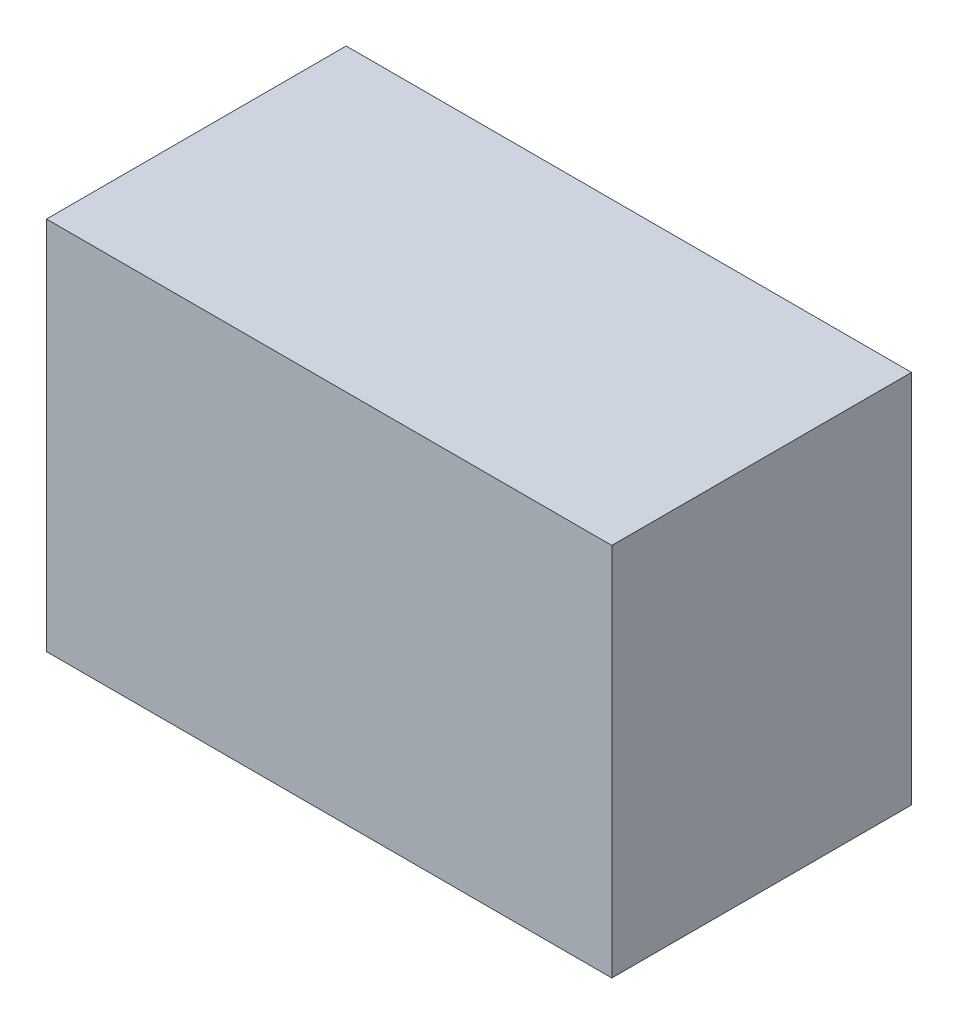
ISO-10303-21;
HEADER;
FILE_DESCRIPTION(('STEP AP214'),'2;1');
FILE_NAME('part.step','',(''),(''),'','','');
FILE_SCHEMA(('AUTOMOTIVE_DESIGN { 1 0 10303 214 1 1 1 1 }'));
ENDSEC;
DATA;
#1=APPLICATION_CONTEXT('core data for automotive mechanical design processes');
#2=APPLICATION_PROTOCOL_DEFINITION('international standard','automotive_design',2000,#1);
#3=PRODUCT_CONTEXT('',#1,'mechanical');
#4=PRODUCT('Part','Part','',(#3));
#5=PRODUCT_RELATED_PRODUCT_CATEGORY('part','',(#4));
#6=PRODUCT_DEFINITION_FORMATION('','',#4);
#7=PRODUCT_DEFINITION_CONTEXT('part definition',#1,'design');
#8=PRODUCT_DEFINITION('design','',#6,#7);
#9=PRODUCT_DEFINITION_SHAPE('','',#8);
#10=(LENGTH_UNIT() NAMED_UNIT(*) SI_UNIT(.MILLI.,.METRE.));
#11=(NAMED_UNIT(*) PLANE_ANGLE_UNIT() SI_UNIT($,.RADIAN.));
#12=(NAMED_UNIT(*) SI_UNIT($,.STERADIAN.) SOLID_ANGLE_UNIT());
#13=UNCERTAINTY_MEASURE_WITH_UNIT(LENGTH_MEASURE(1.E-05),#10,'distance_accuracy_value','');
#14=(GEOMETRIC_REPRESENTATION_CONTEXT(3) GLOBAL_UNCERTAINTY_ASSIGNED_CONTEXT((#13)) GLOBAL_UNIT_ASSIGNED_CONTEXT((#10,
#11,#12)) REPRESENTATION_CONTEXT('',''));
#15=CARTESIAN_POINT('',(0.,0.,0.));
#16=DIRECTION('',(0.,0.,1.));
#17=DIRECTION('',(1.,0.,0.));
#18=AXIS2_PLACEMENT_3D('',#15,#16,#17);
#19=CARTESIAN_POINT('',(166.,220.,-88.));
#20=DIRECTION('',(-1.,0.,0.));
#21=DIRECTION('',(0.,0.,1.));
#22=AXIS2_PLACEMENT_3D('',#19,#20,#21);
#23=PLANE('',#22);
#24=DIRECTION('',(0.,0.,-1.));
#25=VECTOR('',#24,1.);
#26=CARTESIAN_POINT('',(166.,0.,-88.));
#27=LINE('',#26,#25);
#28=CARTESIAN_POINT('',(166.,0.,88.));
#29=VERTEX_POINT('',#28);
#30=CARTESIAN_POINT('',(166.,0.,-88.));
#31=VERTEX_POINT('',#30);
#32=EDGE_CURVE('E102',#29,#31,#27,.T.);
#33=ORIENTED_EDGE('',*,*,#32,.T.);
#34=DIRECTION('',(0.,-1.,0.));
#35=VECTOR('',#34,1.);
#36=CARTESIAN_POINT('',(166.,220.,-88.));
#37=LINE('',#36,#35);
#38=CARTESIAN_POINT('',(166.,220.,-88.));
#39=VERTEX_POINT('',#38);
#40=EDGE_CURVE('E11',#39,#31,#37,.T.);
#41=ORIENTED_EDGE('',*,*,#40,.F.);
#42=DIRECTION('',(0.,0.,-1.));
#43=VECTOR('',#42,1.);
#44=CARTESIAN_POINT('',(166.,220.,-88.));
#45=LINE('',#44,#43);
#46=CARTESIAN_POINT('',(166.,220.,88.));
#47=VERTEX_POINT('',#46);
#48=EDGE_CURVE('E90',#47,#39,#45,.T.);
#49=ORIENTED_EDGE('',*,*,#48,.F.);
#50=DIRECTION('',(0.,-1.,0.));
#51=VECTOR('',#50,1.);
#52=CARTESIAN_POINT('',(166.,220.,88.));
#53=LINE('',#52,#51);
#54=EDGE_CURVE('E98',#47,#29,#53,.T.);
#55=ORIENTED_EDGE('',*,*,#54,.T.);
#56=EDGE_LOOP('',(#33,#41,#49,#55));
#57=FACE_BOUND('',#56,.T.);
#58=ADVANCED_FACE('F39',(#57),#23,.F.);
#59=CARTESIAN_POINT('',(-166.,220.,-88.));
#60=DIRECTION('',(0.,0.,1.));
#61=DIRECTION('',(1.,0.,0.));
#62=AXIS2_PLACEMENT_3D('',#59,#60,#61);
#63=PLANE('',#62);
#64=DIRECTION('',(-1.,0.,0.));
#65=VECTOR('',#64,1.);
#66=CARTESIAN_POINT('',(-166.,0.,-88.));
#67=LINE('',#66,#65);
#68=CARTESIAN_POINT('',(-166.,0.,-88.));
#69=VERTEX_POINT('',#68);
#70=EDGE_CURVE('E94',#31,#69,#67,.T.);
#71=ORIENTED_EDGE('',*,*,#70,.T.);
#72=DIRECTION('',(0.,-1.,0.));
#73=VECTOR('',#72,1.);
#74=CARTESIAN_POINT('',(-166.,220.,-88.));
#75=LINE('',#74,#73);
#76=CARTESIAN_POINT('',(-166.,220.,-88.));
#77=VERTEX_POINT('',#76);
#78=EDGE_CURVE('E47',#77,#69,#75,.T.);
#79=ORIENTED_EDGE('',*,*,#78,.F.);
#80=DIRECTION('',(-1.,0.,0.));
#81=VECTOR('',#80,1.);
#82=CARTESIAN_POINT('',(-166.,220.,-88.));
#83=LINE('',#82,#81);
#84=EDGE_CURVE('E85',#39,#77,#83,.T.);
#85=ORIENTED_EDGE('',*,*,#84,.F.);
#86=ORIENTED_EDGE('',*,*,#40,.T.);
#87=EDGE_LOOP('',(#71,#79,#85,#86));
#88=FACE_BOUND('',#87,.T.);
#89=ADVANCED_FACE('F93',(#88),#63,.F.);
#90=CARTESIAN_POINT('',(-166.,220.,-88.));
#91=DIRECTION('',(1.,0.,0.));
#92=DIRECTION('',(0.,0.,-1.));
#93=AXIS2_PLACEMENT_3D('',#90,#91,#92);
#94=PLANE('',#93);
#95=DIRECTION('',(0.,0.,1.));
#96=VECTOR('',#95,1.);
#97=CARTESIAN_POINT('',(-166.,0.,-88.));
#98=LINE('',#97,#96);
#99=CARTESIAN_POINT('',(-166.,0.,88.));
#100=VERTEX_POINT('',#99);
#101=EDGE_CURVE('E72',#69,#100,#98,.T.);
#102=ORIENTED_EDGE('',*,*,#101,.T.);
#103=DIRECTION('',(0.,-1.,0.));
#104=VECTOR('',#103,1.);
#105=CARTESIAN_POINT('',(-166.,220.,88.));
#106=LINE('',#105,#104);
#107=CARTESIAN_POINT('',(-166.,220.,88.));
#108=VERTEX_POINT('',#107);
#109=EDGE_CURVE('E95',#108,#100,#106,.T.);
#110=ORIENTED_EDGE('',*,*,#109,.F.);
#111=DIRECTION('',(0.,0.,1.));
#112=VECTOR('',#111,1.);
#113=CARTESIAN_POINT('',(-166.,220.,-88.));
#114=LINE('',#113,#112);
#115=EDGE_CURVE('E88',#77,#108,#114,.T.);
#116=ORIENTED_EDGE('',*,*,#115,.F.);
#117=ORIENTED_EDGE('',*,*,#78,.T.);
#118=EDGE_LOOP('',(#102,#110,#116,#117));
#119=FACE_BOUND('',#118,.T.);
#120=ADVANCED_FACE('F96',(#119),#94,.F.);
#121=CARTESIAN_POINT('',(-166.,220.,88.));
#122=DIRECTION('',(0.,0.,-1.));
#123=DIRECTION('',(-1.,0.,0.));
#124=AXIS2_PLACEMENT_3D('',#121,#122,#123);
#125=PLANE('',#124);
#126=DIRECTION('',(1.,0.,0.));
#127=VECTOR('',#126,1.);
#128=CARTESIAN_POINT('',(-166.,0.,88.));
#129=LINE('',#128,#127);
#130=EDGE_CURVE('E78',#100,#29,#129,.T.);
#131=ORIENTED_EDGE('',*,*,#130,.T.);
#132=ORIENTED_EDGE('',*,*,#54,.F.);
#133=DIRECTION('',(1.,0.,0.));
#134=VECTOR('',#133,1.);
#135=CARTESIAN_POINT('',(-166.,220.,88.));
#136=LINE('',#135,#134);
#137=EDGE_CURVE('E55',#108,#47,#136,.T.);
#138=ORIENTED_EDGE('',*,*,#137,.F.);
#139=ORIENTED_EDGE('',*,*,#109,.T.);
#140=EDGE_LOOP('',(#131,#132,#138,#139));
#141=FACE_BOUND('',#140,.T.);
#142=ADVANCED_FACE('F109',(#141),#125,.F.);
#143=CARTESIAN_POINT('',(0.,220.,0.));
#144=DIRECTION('',(0.,1.,0.));
#145=DIRECTION('',(0.,0.,1.));
#146=AXIS2_PLACEMENT_3D('',#143,#144,#145);
#147=PLANE('',#146);
#148=ORIENTED_EDGE('',*,*,#48,.T.);
#149=ORIENTED_EDGE('',*,*,#84,.T.);
#150=ORIENTED_EDGE('',*,*,#115,.T.);
#151=ORIENTED_EDGE('',*,*,#137,.T.);
#152=EDGE_LOOP('',(#148,#149,#150,#151));
#153=FACE_BOUND('',#152,.T.);
#154=ADVANCED_FACE('F86',(#153),#147,.T.);
#155=CARTESIAN_POINT('',(0.,0.,0.));
#156=DIRECTION('',(0.,1.,0.));
#157=DIRECTION('',(0.,0.,1.));
#158=AXIS2_PLACEMENT_3D('',#155,#156,#157);
#159=PLANE('',#158);
#160=ORIENTED_EDGE('',*,*,#32,.F.);
#161=ORIENTED_EDGE('',*,*,#130,.F.);
#162=ORIENTED_EDGE('',*,*,#101,.F.);
#163=ORIENTED_EDGE('',*,*,#70,.F.);
#164=EDGE_LOOP('',(#160,#161,#162,#163));
#165=FACE_BOUND('',#164,.T.);
#166=ADVANCED_FACE('F112',(#165),#159,.F.);
#167=CLOSED_SHELL('',(#58,#89,#120,#142,#154,#166));
#168=MANIFOLD_SOLID_BREP('B2',#167);
#169=ADVANCED_BREP_SHAPE_REPRESENTATION('',(#18,#168),#14);
#170=SHAPE_DEFINITION_REPRESENTATION(#9,#169);
ENDSEC;
END-ISO-10303-21;
